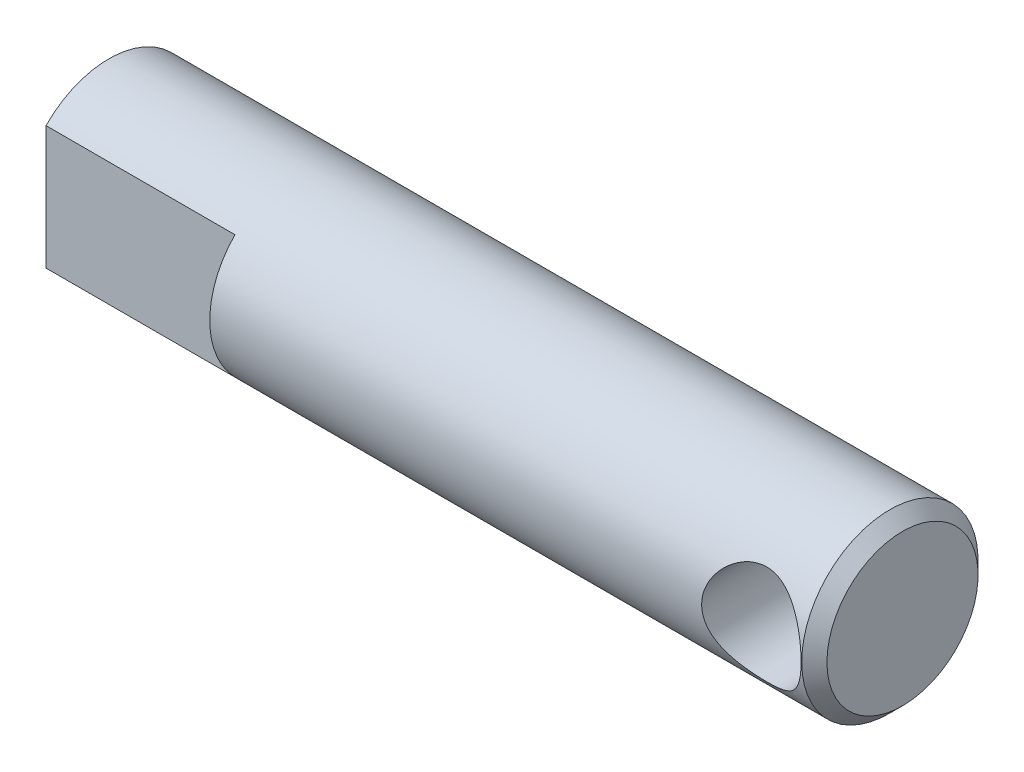
ISO-10303-21;
HEADER;
FILE_DESCRIPTION(('STEP AP214'),'2;1');
FILE_NAME('part.step','',(''),(''),'','','');
FILE_SCHEMA(('AUTOMOTIVE_DESIGN { 1 0 10303 214 1 1 1 1 }'));
ENDSEC;
DATA;
#1=APPLICATION_CONTEXT('core data for automotive mechanical design processes');
#2=APPLICATION_PROTOCOL_DEFINITION('international standard','automotive_design',2000,#1);
#3=PRODUCT_CONTEXT('',#1,'mechanical');
#4=PRODUCT('Part','Part','',(#3));
#5=PRODUCT_RELATED_PRODUCT_CATEGORY('part','',(#4));
#6=PRODUCT_DEFINITION_FORMATION('','',#4);
#7=PRODUCT_DEFINITION_CONTEXT('part definition',#1,'design');
#8=PRODUCT_DEFINITION('design','',#6,#7);
#9=PRODUCT_DEFINITION_SHAPE('','',#8);
#10=(LENGTH_UNIT() NAMED_UNIT(*) SI_UNIT(.MILLI.,.METRE.));
#11=(NAMED_UNIT(*) PLANE_ANGLE_UNIT() SI_UNIT($,.RADIAN.));
#12=(NAMED_UNIT(*) SI_UNIT($,.STERADIAN.) SOLID_ANGLE_UNIT());
#13=UNCERTAINTY_MEASURE_WITH_UNIT(LENGTH_MEASURE(1.E-05),#10,'distance_accuracy_value','');
#14=(GEOMETRIC_REPRESENTATION_CONTEXT(3) GLOBAL_UNCERTAINTY_ASSIGNED_CONTEXT((#13)) GLOBAL_UNIT_ASSIGNED_CONTEXT((#10,
#11,#12)) REPRESENTATION_CONTEXT('',''));
#15=CARTESIAN_POINT('',(0.,0.,0.));
#16=DIRECTION('',(0.,0.,1.));
#17=DIRECTION('',(1.,0.,0.));
#18=AXIS2_PLACEMENT_3D('',#15,#16,#17);
#19=CARTESIAN_POINT('',(-58.,7.,0.));
#20=DIRECTION('',(-1.,0.,0.));
#21=DIRECTION('',(0.,0.,1.));
#22=AXIS2_PLACEMENT_3D('',#19,#20,#21);
#23=PLANE('',#22);
#24=DIRECTION('',(0.,-1.,0.));
#25=VECTOR('',#24,1.);
#26=CARTESIAN_POINT('',(-58.,7.,5.));
#27=LINE('',#26,#25);
#28=CARTESIAN_POINT('',(-58.,4.89897948556636,5.));
#29=VERTEX_POINT('',#28);
#30=CARTESIAN_POINT('',(-58.,-4.89897948556636,5.));
#31=VERTEX_POINT('',#30);
#32=EDGE_CURVE('E57',#29,#31,#27,.T.);
#33=ORIENTED_EDGE('',*,*,#32,.F.);
#34=CARTESIAN_POINT('',(-58.,0.,0.));
#35=DIRECTION('',(1.,0.,0.));
#36=DIRECTION('',(0.,0.,-1.));
#37=AXIS2_PLACEMENT_3D('',#34,#35,#36);
#38=CIRCLE('',#37,7.);
#39=EDGE_CURVE('E63',#31,#29,#38,.T.);
#40=ORIENTED_EDGE('',*,*,#39,.F.);
#41=EDGE_LOOP('',(#33,#40));
#42=FACE_BOUND('',#41,.T.);
#43=ADVANCED_FACE('F31',(#42),#23,.T.);
#44=CARTESIAN_POINT('',(9.,0.,0.));
#45=DIRECTION('',(1.,0.,0.));
#46=DIRECTION('',(0.,0.,-1.));
#47=AXIS2_PLACEMENT_3D('',#44,#45,#46);
#48=CYLINDRICAL_SURFACE('',#47,7.);
#49=ORIENTED_EDGE('',*,*,#39,.T.);
#50=DIRECTION('',(1.,0.,0.));
#51=VECTOR('',#50,1.);
#52=CARTESIAN_POINT('',(9.,4.89897948556636,5.));
#53=LINE('',#52,#51);
#54=CARTESIAN_POINT('',(-43.,4.89897948556636,5.));
#55=VERTEX_POINT('',#54);
#56=EDGE_CURVE('E11',#29,#55,#53,.T.);
#57=ORIENTED_EDGE('',*,*,#56,.T.);
#58=CARTESIAN_POINT('',(-43.,0.,0.));
#59=DIRECTION('',(1.,0.,0.));
#60=DIRECTION('',(0.,0.,-1.));
#61=AXIS2_PLACEMENT_3D('',#58,#59,#60);
#62=CIRCLE('',#61,7.);
#63=CARTESIAN_POINT('',(-43.,-4.89897948556636,5.));
#64=VERTEX_POINT('',#63);
#65=EDGE_CURVE('E48',#55,#64,#62,.T.);
#66=ORIENTED_EDGE('',*,*,#65,.T.);
#67=DIRECTION('',(1.,0.,0.));
#68=VECTOR('',#67,1.);
#69=CARTESIAN_POINT('',(9.,-4.89897948556636,5.));
#70=LINE('',#69,#68);
#71=EDGE_CURVE('E38',#64,#31,#70,.F.);
#72=ORIENTED_EDGE('',*,*,#71,.T.);
#73=EDGE_LOOP('',(#49,#57,#66,#72));
#74=FACE_BOUND('',#73,.T.);
#75=CARTESIAN_POINT('',(-3.95,0.,-7.));
#76=CARTESIAN_POINT('',(-3.95000058229968,-0.102251517315988,-7.00000052515467));
#77=CARTESIAN_POINT('',(-3.94602532965664,-0.204495359820292,-6.9977548696408));
#78=CARTESIAN_POINT('',(-3.93017892197439,-0.408208963369242,-6.98883132618644));
#79=CARTESIAN_POINT('',(-3.91830515468346,-0.509678457082319,-6.9821519719038));
#80=CARTESIAN_POINT('',(-3.88681829331304,-0.71099675225549,-6.96453050247907));
#81=CARTESIAN_POINT('',(-3.86720800287233,-0.810846127198378,-6.95358993157764));
#82=CARTESIAN_POINT('',(-3.82049887175145,-1.00826437642642,-6.9277225782592));
#83=CARTESIAN_POINT('',(-3.79339695367379,-1.10583229563719,-6.91279415780534));
#84=CARTESIAN_POINT('',(-3.70154393565608,-1.39332234634672,-6.86267096158378));
#85=CARTESIAN_POINT('',(-3.62608925991541,-1.57900775924912,-6.82204762479848));
#86=CARTESIAN_POINT('',(-3.4495398667259,-1.93460470066014,-6.72987207509922));
#87=CARTESIAN_POINT('',(-3.34843878537853,-2.10451229974636,-6.67831715014308));
#88=CARTESIAN_POINT('',(-3.11541319088434,-2.4373825510914,-6.56446698014009));
#89=CARTESIAN_POINT('',(-2.98181142423425,-2.59899854751172,-6.50166938488147));
#90=CARTESIAN_POINT('',(-2.69128288366082,-2.89881930126449,-6.37365581580938));
#91=CARTESIAN_POINT('',(-2.53433164171031,-3.03699917073816,-6.30843735962425));
#92=CARTESIAN_POINT('',(-2.18195788836069,-3.30075276159229,-6.17487604826758));
#93=CARTESIAN_POINT('',(-1.98422426953324,-3.4234640324862,-6.10692807286785));
#94=CARTESIAN_POINT('',(-1.56699100921049,-3.63336744952713,-5.98443781927963));
#95=CARTESIAN_POINT('',(-1.34752403403217,-3.72061192584348,-5.92987583797983));
#96=CARTESIAN_POINT('',(-0.941685488864659,-3.8406144795826,-5.8526598046884));
#97=CARTESIAN_POINT('',(-0.758419668197227,-3.88107518918972,-5.82565727502585));
#98=CARTESIAN_POINT('',(-0.386365503527543,-3.93553961991789,-5.7890115890265));
#99=CARTESIAN_POINT('',(-0.197583058799509,-3.94957062322531,-5.77935053235977));
#100=CARTESIAN_POINT('',(0.180299209819715,-3.95041047434906,-5.77877642043474));
#101=CARTESIAN_POINT('',(0.369399137282388,-3.93718559824471,-5.78788659096481));
#102=CARTESIAN_POINT('',(0.742189320599509,-3.88421908138932,-5.82355728050967));
#103=CARTESIAN_POINT('',(0.925875864342434,-3.84445966750014,-5.85012949561958));
#104=CARTESIAN_POINT('',(1.28298214469667,-3.74045603966377,-5.9171579541693));
#105=CARTESIAN_POINT('',(1.45642117099845,-3.67625963941088,-5.95758706974617));
#106=CARTESIAN_POINT('',(1.79062015956483,-3.52559585985768,-6.04796487029345));
#107=CARTESIAN_POINT('',(1.95137518723374,-3.43911986814313,-6.09791723463147));
#108=CARTESIAN_POINT('',(2.28236010008667,-3.23068430055509,-6.21118494442007));
#109=CARTESIAN_POINT('',(2.45013429373665,-3.10528927697339,-6.27536808079486));
#110=CARTESIAN_POINT('',(2.76380860346137,-2.82975913036282,-6.40434802616528));
#111=CARTESIAN_POINT('',(2.90969050144035,-2.67960361809532,-6.46914529908047));
#112=CARTESIAN_POINT('',(3.19135719262201,-2.33913134637791,-6.60038474771934));
#113=CARTESIAN_POINT('',(3.3243448867421,-2.14622765168104,-6.66624727952808));
#114=CARTESIAN_POINT('',(3.49755856369914,-1.8394110225997,-6.75484935316411));
#115=CARTESIAN_POINT('',(3.5509340604089,-1.73418447928273,-6.78269356672089));
#116=CARTESIAN_POINT('',(3.64835561995455,-1.51854178185735,-6.83419932092055));
#117=CARTESIAN_POINT('',(3.6924073073643,-1.40812880586604,-6.8578633818007));
#118=CARTESIAN_POINT('',(3.76787358823268,-1.1907703175535,-6.89879992749264));
#119=CARTESIAN_POINT('',(3.79995387877932,-1.08411750321206,-6.91640241862664));
#120=CARTESIAN_POINT('',(3.85508846813581,-0.867888305117478,-6.94684659935765));
#121=CARTESIAN_POINT('',(3.87814758343191,-0.758313514907071,-6.95969082923802));
#122=CARTESIAN_POINT('',(3.91490558552098,-0.537187282351893,-6.98024022201434));
#123=CARTESIAN_POINT('',(3.92860947395772,-0.425636928996057,-6.98794813092116));
#124=CARTESIAN_POINT('',(3.94645574808905,-0.201537487981697,-6.99799667991412));
#125=CARTESIAN_POINT('',(3.95059914380671,-0.0889885070849194,-7.00033788696801));
#126=CARTESIAN_POINT('',(3.94933984835044,0.122739112806892,-6.999627663868));
#127=CARTESIAN_POINT('',(3.94500600891487,0.221928156730359,-6.9971800258877));
#128=CARTESIAN_POINT('',(3.92890769693735,0.419541214099354,-6.98811643314823));
#129=CARTESIAN_POINT('',(3.9171408937678,0.517964977786675,-6.98149917099278));
#130=CARTESIAN_POINT('',(3.88632356148884,0.713271189815941,-6.96425493220245));
#131=CARTESIAN_POINT('',(3.86727582156901,0.810154213601039,-6.95362949104584));
#132=CARTESIAN_POINT('',(3.82212560802785,1.00178001994375,-6.92862156381387));
#133=CARTESIAN_POINT('',(3.79602041470714,1.09652196211863,-6.91423762941641));
#134=CARTESIAN_POINT('',(3.70796490716032,1.37520140354296,-6.86615280219762));
#135=CARTESIAN_POINT('',(3.6360120983509,1.55521927097772,-6.82736706558476));
#136=CARTESIAN_POINT('',(3.46798264590113,1.90068274218608,-6.7393842529718));
#137=CARTESIAN_POINT('',(3.37189990509257,2.06612464860167,-6.69018454605692));
#138=CARTESIAN_POINT('',(3.14705514470242,2.396342083349,-6.57958100446345));
#139=CARTESIAN_POINT('',(3.01593700358357,2.55926795827144,-6.51744059794736));
#140=CARTESIAN_POINT('',(2.73029779406948,2.86205898239886,-6.39027857881677));
#141=CARTESIAN_POINT('',(2.57575036297958,3.00189777894503,-6.32525377972724));
#142=CARTESIAN_POINT('',(2.22814868630097,3.26970877997797,-6.19142208794046));
#143=CARTESIAN_POINT('',(2.03274539017254,3.39482368283485,-6.1229517250769));
#144=CARTESIAN_POINT('',(1.61992336933148,3.61003258813635,-5.99859885164004));
#145=CARTESIAN_POINT('',(1.40253539360327,3.70017467433934,-5.94269910266251));
#146=CARTESIAN_POINT('',(0.998820895349188,3.82617779247838,-5.86214396950896));
#147=CARTESIAN_POINT('',(0.815640420110194,3.86948469622016,-5.83338201215317));
#148=CARTESIAN_POINT('',(0.443198214968325,3.92957457174216,-5.79308238692371));
#149=CARTESIAN_POINT('',(0.25394324747597,3.94638606129021,-5.78152620073133));
#150=CARTESIAN_POINT('',(-0.125543425182169,3.95257042625895,-5.77730100738671));
#151=CARTESIAN_POINT('',(-0.315776226459909,3.94189800237312,-5.78466318165361));
#152=CARTESIAN_POINT('',(-0.691265690283317,3.89365345455563,-5.81723896038137));
#153=CARTESIAN_POINT('',(-0.876519097368938,3.85606415621473,-5.84246396217007));
#154=CARTESIAN_POINT('',(-1.23541979646161,3.75640700698153,-5.90701621053113));
#155=CARTESIAN_POINT('',(-1.40916943860999,3.69460331462009,-5.94619087128511));
#156=CARTESIAN_POINT('',(-1.74430775511907,3.54870957533306,-6.03439418933587));
#157=CARTESIAN_POINT('',(-1.90569172996657,3.46461110900606,-6.08342656760856));
#158=CARTESIAN_POINT('',(-2.2377542797809,3.26165195779923,-6.19491384953215));
#159=CARTESIAN_POINT('',(-2.40608544503581,3.1394432010389,-6.25827492830392));
#160=CARTESIAN_POINT('',(-2.72141173187042,2.87044638462706,-6.38613993769508));
#161=CARTESIAN_POINT('',(-2.86838923126927,2.72363823696084,-6.45064476349501));
#162=CARTESIAN_POINT('',(-3.1539902095016,2.38923649410488,-6.582346453761));
#163=CARTESIAN_POINT('',(-3.289706311614,2.19889363032371,-6.64899899465461));
#164=CARTESIAN_POINT('',(-3.46740626908797,1.89562056957862,-6.73927571273664));
#165=CARTESIAN_POINT('',(-3.52234673856915,1.79151722147474,-6.76776192040192));
#166=CARTESIAN_POINT('',(-3.62302778708241,1.57799652933566,-6.82070293485497));
#167=CARTESIAN_POINT('',(-3.66877372048784,1.46858232440234,-6.84516008642963));
#168=CARTESIAN_POINT('',(-3.74887272159233,1.24960503542487,-6.88842927503793));
#169=CARTESIAN_POINT('',(-3.78360192343559,1.14021572641841,-6.9074249369911));
#170=CARTESIAN_POINT('',(-3.8435231163064,0.918172875715541,-6.94042819529847));
#171=CARTESIAN_POINT('',(-3.86872028883089,0.805521143391853,-6.95443850138572));
#172=CARTESIAN_POINT('',(-3.90919292781781,0.577976600975192,-6.97703428635344));
#173=CARTESIAN_POINT('',(-3.92447410061723,0.463085119068812,-6.98562288517352));
#174=CARTESIAN_POINT('',(-3.94487669333219,0.232125699912259,-6.99710510040047));
#175=CARTESIAN_POINT('',(-3.94999933907601,0.116057906306619,-6.99999940393695));
#176=CARTESIAN_POINT('',(-3.95,0.,-7.));
#177=B_SPLINE_CURVE_WITH_KNOTS('',3,(#75,#76,#77,#78,#79,#80,#81,#82,#83,#84,#85,#86,#87,#88,
#89,#90,#91,#92,#93,#94,#95,#96,#97,#98,#99,#100,#101,#102,#103,#104,#105,#106,#107,#108,#109,
#110,#111,#112,#113,#114,#115,#116,#117,#118,#119,#120,#121,#122,#123,#124,#125,#126,#127,#128,
#129,#130,#131,#132,#133,#134,#135,#136,#137,#138,#139,#140,#141,#142,#143,#144,#145,#146,#147,
#148,#149,#150,#151,#152,#153,#154,#155,#156,#157,#158,#159,#160,#161,#162,#163,#164,#165,#166,
#167,#168,#169,#170,#171,#172,#173,#174,#175,#176),.UNSPECIFIED.,.T.,.F.,(4,2,2,2,2,2,2,2,2,2,2,
2,2,2,2,2,2,2,2,2,2,2,2,2,2,2,2,2,2,2,2,2,2,2,2,2,2,2,2,2,2,2,2,2,2,2,2,2,2,2,4),(0.,
0.306639567913869,0.613380600253471,0.920010574661891,1.22676669364413,1.83733627202599,
2.44805750558699,3.10208213867895,3.75679701884942,4.48049845448436,5.20312818101679,
5.76949550200641,6.33527786664807,6.90176069866105,7.46862334871127,8.03438252266755,
8.60036072587822,9.25493189929951,9.91004480164386,10.6359893022427,10.9992431122669,
11.3622771614544,11.7000692110085,12.0376806634263,12.3751114748528,12.7125066365984,
13.0100849902233,13.3077566967609,13.6053144849769,13.9029871055704,14.4934275209976,
15.0840172796996,15.7358754883494,16.3884726894367,17.1106877244308,17.8319062446257,
18.400690244766,18.9688616273939,19.5379700758605,20.1074419699607,20.6708670454462,
21.2345051966979,21.8842624324843,22.5345528732439,23.2596712342391,23.6225679953757,
23.985252809904,24.3337283307974,24.6820141514442,25.0300993667069,25.3781425760108),.UNSPECIFIED.);
#178=CARTESIAN_POINT('',(-3.95,0.,-7.));
#179=VERTEX_POINT('',#178);
#180=EDGE_CURVE('E68',#179,#179,#177,.T.);
#181=ORIENTED_EDGE('',*,*,#180,.T.);
#182=EDGE_LOOP('',(#181));
#183=FACE_BOUND('',#182,.T.);
#184=CARTESIAN_POINT('',(3.95,0.,7.));
#185=CARTESIAN_POINT('',(3.95000058229968,-0.102251517315988,7.00000052515467));
#186=CARTESIAN_POINT('',(3.94602532965664,-0.204495359820292,6.9977548696408));
#187=CARTESIAN_POINT('',(3.93017892197439,-0.408208963369242,6.98883132618644));
#188=CARTESIAN_POINT('',(3.91830515468346,-0.509678457082319,6.9821519719038));
#189=CARTESIAN_POINT('',(3.88681829331304,-0.71099675225549,6.96453050247907));
#190=CARTESIAN_POINT('',(3.86720800287233,-0.810846127198378,6.95358993157764));
#191=CARTESIAN_POINT('',(3.82049887175145,-1.00826437642642,6.9277225782592));
#192=CARTESIAN_POINT('',(3.79339695367379,-1.10583229563719,6.91279415780534));
#193=CARTESIAN_POINT('',(3.70154393565608,-1.39332234634672,6.86267096158378));
#194=CARTESIAN_POINT('',(3.62608925991541,-1.57900775924912,6.82204762479848));
#195=CARTESIAN_POINT('',(3.4495398667259,-1.93460470066014,6.72987207509922));
#196=CARTESIAN_POINT('',(3.34843878537853,-2.10451229974636,6.67831715014308));
#197=CARTESIAN_POINT('',(3.11541319088434,-2.4373825510914,6.56446698014009));
#198=CARTESIAN_POINT('',(2.98181142423425,-2.59899854751172,6.50166938488147));
#199=CARTESIAN_POINT('',(2.69128288366082,-2.89881930126449,6.37365581580938));
#200=CARTESIAN_POINT('',(2.53433164171031,-3.03699917073816,6.30843735962425));
#201=CARTESIAN_POINT('',(2.18195788836069,-3.30075276159229,6.17487604826758));
#202=CARTESIAN_POINT('',(1.98422426953324,-3.4234640324862,6.10692807286785));
#203=CARTESIAN_POINT('',(1.56699100921049,-3.63336744952713,5.98443781927963));
#204=CARTESIAN_POINT('',(1.34752403403217,-3.72061192584348,5.92987583797983));
#205=CARTESIAN_POINT('',(0.941685488864659,-3.8406144795826,5.8526598046884));
#206=CARTESIAN_POINT('',(0.758419668197227,-3.88107518918972,5.82565727502585));
#207=CARTESIAN_POINT('',(0.386365503527543,-3.93553961991789,5.7890115890265));
#208=CARTESIAN_POINT('',(0.197583058799509,-3.94957062322531,5.77935053235977));
#209=CARTESIAN_POINT('',(-0.180299209819715,-3.95041047434906,5.77877642043474));
#210=CARTESIAN_POINT('',(-0.369399137282388,-3.93718559824471,5.78788659096481));
#211=CARTESIAN_POINT('',(-0.742189320599509,-3.88421908138932,5.82355728050967));
#212=CARTESIAN_POINT('',(-0.925875864342434,-3.84445966750014,5.85012949561958));
#213=CARTESIAN_POINT('',(-1.28298214469667,-3.74045603966377,5.9171579541693));
#214=CARTESIAN_POINT('',(-1.45642117099845,-3.67625963941088,5.95758706974617));
#215=CARTESIAN_POINT('',(-1.79062015956483,-3.52559585985768,6.04796487029345));
#216=CARTESIAN_POINT('',(-1.95137518723374,-3.43911986814313,6.09791723463147));
#217=CARTESIAN_POINT('',(-2.28236010008667,-3.23068430055509,6.21118494442007));
#218=CARTESIAN_POINT('',(-2.45013429373665,-3.10528927697339,6.27536808079486));
#219=CARTESIAN_POINT('',(-2.76380860346137,-2.82975913036282,6.40434802616528));
#220=CARTESIAN_POINT('',(-2.90969050144035,-2.67960361809532,6.46914529908047));
#221=CARTESIAN_POINT('',(-3.19135719262201,-2.33913134637791,6.60038474771934));
#222=CARTESIAN_POINT('',(-3.3243448867421,-2.14622765168104,6.66624727952808));
#223=CARTESIAN_POINT('',(-3.49755856369914,-1.8394110225997,6.75484935316411));
#224=CARTESIAN_POINT('',(-3.5509340604089,-1.73418447928273,6.78269356672089));
#225=CARTESIAN_POINT('',(-3.64835561995455,-1.51854178185735,6.83419932092055));
#226=CARTESIAN_POINT('',(-3.6924073073643,-1.40812880586604,6.8578633818007));
#227=CARTESIAN_POINT('',(-3.76787358823268,-1.1907703175535,6.89879992749264));
#228=CARTESIAN_POINT('',(-3.79995387877932,-1.08411750321206,6.91640241862664));
#229=CARTESIAN_POINT('',(-3.85508846813581,-0.867888305117478,6.94684659935765));
#230=CARTESIAN_POINT('',(-3.87814758343191,-0.758313514907071,6.95969082923802));
#231=CARTESIAN_POINT('',(-3.91490558552098,-0.537187282351893,6.98024022201434));
#232=CARTESIAN_POINT('',(-3.92860947395772,-0.425636928996057,6.98794813092116));
#233=CARTESIAN_POINT('',(-3.94645574808905,-0.201537487981697,6.99799667991412));
#234=CARTESIAN_POINT('',(-3.95059914380671,-0.0889885070849194,7.00033788696801));
#235=CARTESIAN_POINT('',(-3.94933984835044,0.122739112806892,6.999627663868));
#236=CARTESIAN_POINT('',(-3.94500600891487,0.221928156730359,6.9971800258877));
#237=CARTESIAN_POINT('',(-3.92890769693735,0.419541214099354,6.98811643314823));
#238=CARTESIAN_POINT('',(-3.9171408937678,0.517964977786675,6.98149917099278));
#239=CARTESIAN_POINT('',(-3.88632356148884,0.713271189815941,6.96425493220245));
#240=CARTESIAN_POINT('',(-3.86727582156901,0.810154213601039,6.95362949104584));
#241=CARTESIAN_POINT('',(-3.82212560802785,1.00178001994375,6.92862156381387));
#242=CARTESIAN_POINT('',(-3.79602041470714,1.09652196211863,6.91423762941641));
#243=CARTESIAN_POINT('',(-3.70796490716032,1.37520140354296,6.86615280219762));
#244=CARTESIAN_POINT('',(-3.6360120983509,1.55521927097772,6.82736706558476));
#245=CARTESIAN_POINT('',(-3.46798264590113,1.90068274218608,6.7393842529718));
#246=CARTESIAN_POINT('',(-3.37189990509257,2.06612464860167,6.69018454605692));
#247=CARTESIAN_POINT('',(-3.14705514470242,2.396342083349,6.57958100446345));
#248=CARTESIAN_POINT('',(-3.01593700358357,2.55926795827144,6.51744059794736));
#249=CARTESIAN_POINT('',(-2.73029779406948,2.86205898239886,6.39027857881677));
#250=CARTESIAN_POINT('',(-2.57575036297958,3.00189777894503,6.32525377972724));
#251=CARTESIAN_POINT('',(-2.22814868630097,3.26970877997797,6.19142208794046));
#252=CARTESIAN_POINT('',(-2.03274539017254,3.39482368283485,6.1229517250769));
#253=CARTESIAN_POINT('',(-1.61992336933148,3.61003258813635,5.99859885164004));
#254=CARTESIAN_POINT('',(-1.40253539360327,3.70017467433934,5.94269910266251));
#255=CARTESIAN_POINT('',(-0.998820895349188,3.82617779247838,5.86214396950896));
#256=CARTESIAN_POINT('',(-0.815640420110194,3.86948469622016,5.83338201215317));
#257=CARTESIAN_POINT('',(-0.443198214968325,3.92957457174216,5.79308238692371));
#258=CARTESIAN_POINT('',(-0.25394324747597,3.94638606129021,5.78152620073133));
#259=CARTESIAN_POINT('',(0.125543425182169,3.95257042625895,5.77730100738671));
#260=CARTESIAN_POINT('',(0.315776226459909,3.94189800237312,5.78466318165361));
#261=CARTESIAN_POINT('',(0.691265690283317,3.89365345455563,5.81723896038137));
#262=CARTESIAN_POINT('',(0.876519097368938,3.85606415621473,5.84246396217007));
#263=CARTESIAN_POINT('',(1.23541979646161,3.75640700698153,5.90701621053113));
#264=CARTESIAN_POINT('',(1.40916943860999,3.69460331462009,5.94619087128511));
#265=CARTESIAN_POINT('',(1.74430775511907,3.54870957533306,6.03439418933587));
#266=CARTESIAN_POINT('',(1.90569172996657,3.46461110900606,6.08342656760856));
#267=CARTESIAN_POINT('',(2.2377542797809,3.26165195779923,6.19491384953215));
#268=CARTESIAN_POINT('',(2.40608544503581,3.1394432010389,6.25827492830392));
#269=CARTESIAN_POINT('',(2.72141173187042,2.87044638462706,6.38613993769508));
#270=CARTESIAN_POINT('',(2.86838923126927,2.72363823696084,6.45064476349501));
#271=CARTESIAN_POINT('',(3.1539902095016,2.38923649410488,6.582346453761));
#272=CARTESIAN_POINT('',(3.289706311614,2.19889363032371,6.64899899465461));
#273=CARTESIAN_POINT('',(3.46740626908797,1.89562056957862,6.73927571273664));
#274=CARTESIAN_POINT('',(3.52234673856915,1.79151722147474,6.76776192040192));
#275=CARTESIAN_POINT('',(3.62302778708241,1.57799652933566,6.82070293485497));
#276=CARTESIAN_POINT('',(3.66877372048784,1.46858232440234,6.84516008642963));
#277=CARTESIAN_POINT('',(3.74887272159233,1.24960503542487,6.88842927503793));
#278=CARTESIAN_POINT('',(3.78360192343559,1.14021572641841,6.9074249369911));
#279=CARTESIAN_POINT('',(3.8435231163064,0.918172875715541,6.94042819529847));
#280=CARTESIAN_POINT('',(3.86872028883089,0.805521143391853,6.95443850138572));
#281=CARTESIAN_POINT('',(3.90919292781781,0.577976600975192,6.97703428635344));
#282=CARTESIAN_POINT('',(3.92447410061723,0.463085119068812,6.98562288517352));
#283=CARTESIAN_POINT('',(3.94487669333219,0.232125699912259,6.99710510040047));
#284=CARTESIAN_POINT('',(3.94999933907601,0.116057906306619,6.99999940393695));
#285=CARTESIAN_POINT('',(3.95,0.,7.));
#286=B_SPLINE_CURVE_WITH_KNOTS('',3,(#184,#185,#186,#187,#188,#189,#190,#191,#192,#193,#194,
#195,#196,#197,#198,#199,#200,#201,#202,#203,#204,#205,#206,#207,#208,#209,#210,#211,#212,#213,
#214,#215,#216,#217,#218,#219,#220,#221,#222,#223,#224,#225,#226,#227,#228,#229,#230,#231,#232,
#233,#234,#235,#236,#237,#238,#239,#240,#241,#242,#243,#244,#245,#246,#247,#248,#249,#250,#251,
#252,#253,#254,#255,#256,#257,#258,#259,#260,#261,#262,#263,#264,#265,#266,#267,#268,#269,#270,
#271,#272,#273,#274,#275,#276,#277,#278,#279,#280,#281,#282,#283,#284,#285),.UNSPECIFIED.,.T.,
.F.,(4,2,2,2,2,2,2,2,2,2,2,2,2,2,2,2,2,2,2,2,2,2,2,2,2,2,2,2,2,2,2,2,2,2,2,2,2,2,2,2,2,2,2,2,2,
2,2,2,2,2,4),(0.,0.306639567913869,0.613380600253471,0.920010574661891,1.22676669364413,
1.83733627202599,2.44805750558699,3.10208213867895,3.75679701884942,4.48049845448436,
5.20312818101679,5.76949550200641,6.33527786664807,6.90176069866105,7.46862334871127,
8.03438252266755,8.60036072587822,9.25493189929951,9.91004480164386,10.6359893022427,
10.9992431122669,11.3622771614544,11.7000692110085,12.0376806634263,12.3751114748528,
12.7125066365984,13.0100849902233,13.3077566967609,13.6053144849769,13.9029871055704,
14.4934275209976,15.0840172796996,15.7358754883494,16.3884726894367,17.1106877244308,
17.8319062446257,18.400690244766,18.9688616273939,19.5379700758605,20.1074419699607,
20.6708670454462,21.2345051966979,21.8842624324843,22.5345528732439,23.2596712342391,
23.6225679953757,23.985252809904,24.3337283307974,24.6820141514442,25.0300993667069,
25.3781425760108),.UNSPECIFIED.);
#287=CARTESIAN_POINT('',(3.95,0.,7.));
#288=VERTEX_POINT('',#287);
#289=EDGE_CURVE('E74',#288,#288,#286,.T.);
#290=ORIENTED_EDGE('',*,*,#289,.T.);
#291=EDGE_LOOP('',(#290));
#292=FACE_BOUND('',#291,.T.);
#293=CARTESIAN_POINT('',(3.99999999999999,0.,0.));
#294=DIRECTION('',(-1.,0.,0.));
#295=DIRECTION('',(0.,0.,1.));
#296=AXIS2_PLACEMENT_3D('',#293,#294,#295);
#297=CIRCLE('',#296,7.);
#298=CARTESIAN_POINT('',(3.99999999999999,0.,7.));
#299=VERTEX_POINT('',#298);
#300=EDGE_CURVE('E71',#299,#299,#297,.T.);
#301=ORIENTED_EDGE('',*,*,#300,.T.);
#302=EDGE_LOOP('',(#301));
#303=FACE_BOUND('',#302,.T.);
#304=ADVANCED_FACE('F65',(#74,#183,#292,#303),#48,.T.);
#305=CARTESIAN_POINT('',(5.,7.,0.));
#306=DIRECTION('',(-1.,0.,0.));
#307=DIRECTION('',(0.,0.,1.));
#308=AXIS2_PLACEMENT_3D('',#305,#306,#307);
#309=PLANE('',#308);
#310=CARTESIAN_POINT('',(5.,0.,0.));
#311=DIRECTION('',(-1.,0.,0.));
#312=DIRECTION('',(0.,0.,1.));
#313=AXIS2_PLACEMENT_3D('',#310,#311,#312);
#314=CIRCLE('',#313,5.99999999999998);
#315=CARTESIAN_POINT('',(5.,0.,5.99999999999998));
#316=VERTEX_POINT('',#315);
#317=EDGE_CURVE('E67',#316,#316,#314,.F.);
#318=ORIENTED_EDGE('',*,*,#317,.T.);
#319=EDGE_LOOP('',(#318));
#320=FACE_BOUND('',#319,.T.);
#321=ADVANCED_FACE('F99',(#320),#309,.F.);
#322=CARTESIAN_POINT('',(5.,0.,0.));
#323=DIRECTION('',(-1.,0.,0.));
#324=DIRECTION('',(0.,0.,1.));
#325=AXIS2_PLACEMENT_3D('',#322,#323,#324);
#326=CONICAL_SURFACE('',#325,5.99999999999998,0.785398163397453);
#327=ORIENTED_EDGE('',*,*,#300,.F.);
#328=EDGE_LOOP('',(#327));
#329=FACE_BOUND('',#328,.T.);
#330=ORIENTED_EDGE('',*,*,#317,.F.);
#331=EDGE_LOOP('',(#330));
#332=FACE_BOUND('',#331,.T.);
#333=ADVANCED_FACE('F94',(#329,#332),#326,.T.);
#334=CARTESIAN_POINT('',(0.,0.,-10.));
#335=DIRECTION('',(0.,0.,1.));
#336=DIRECTION('',(1.,0.,0.));
#337=AXIS2_PLACEMENT_3D('',#334,#335,#336);
#338=CYLINDRICAL_SURFACE('',#337,3.95);
#339=ORIENTED_EDGE('',*,*,#289,.F.);
#340=EDGE_LOOP('',(#339));
#341=FACE_BOUND('',#340,.T.);
#342=ORIENTED_EDGE('',*,*,#180,.F.);
#343=EDGE_LOOP('',(#342));
#344=FACE_BOUND('',#343,.T.);
#345=ADVANCED_FACE('F89',(#341,#344),#338,.F.);
#346=CARTESIAN_POINT('',(-43.,7.,5.));
#347=DIRECTION('',(0.,0.,-1.));
#348=DIRECTION('',(-1.,0.,0.));
#349=AXIS2_PLACEMENT_3D('',#346,#347,#348);
#350=PLANE('',#349);
#351=ORIENTED_EDGE('',*,*,#32,.T.);
#352=ORIENTED_EDGE('',*,*,#71,.F.);
#353=DIRECTION('',(0.,-1.,0.));
#354=VECTOR('',#353,1.);
#355=CARTESIAN_POINT('',(-43.,7.,5.));
#356=LINE('',#355,#354);
#357=EDGE_CURVE('E44',#55,#64,#356,.T.);
#358=ORIENTED_EDGE('',*,*,#357,.F.);
#359=ORIENTED_EDGE('',*,*,#56,.F.);
#360=EDGE_LOOP('',(#351,#352,#358,#359));
#361=FACE_BOUND('',#360,.T.);
#362=ADVANCED_FACE('F56',(#361),#350,.F.);
#363=CARTESIAN_POINT('',(-43.,-6.,5.));
#364=DIRECTION('',(1.,0.,0.));
#365=DIRECTION('',(0.,0.,-1.));
#366=AXIS2_PLACEMENT_3D('',#363,#364,#365);
#367=PLANE('',#366);
#368=ORIENTED_EDGE('',*,*,#357,.T.);
#369=ORIENTED_EDGE('',*,*,#65,.F.);
#370=EDGE_LOOP('',(#368,#369));
#371=FACE_BOUND('',#370,.T.);
#372=ADVANCED_FACE('F138',(#371),#367,.F.);
#373=CLOSED_SHELL('',(#43,#304,#321,#333,#345,#362,#372));
#374=MANIFOLD_SOLID_BREP('B2',#373);
#375=ADVANCED_BREP_SHAPE_REPRESENTATION('',(#18,#374),#14);
#376=SHAPE_DEFINITION_REPRESENTATION(#9,#375);
ENDSEC;
END-ISO-10303-21;
